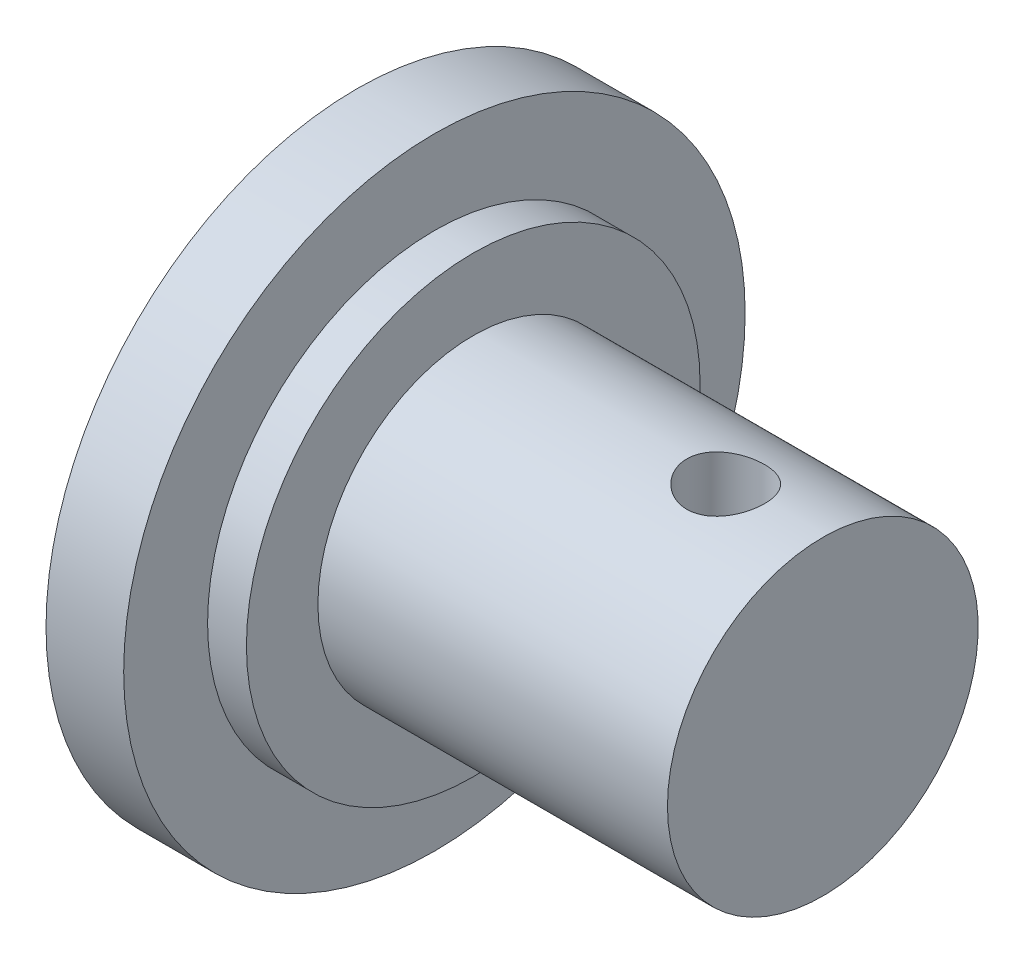
ISO-10303-21;
HEADER;
FILE_DESCRIPTION(('STEP AP214'),'2;1');
FILE_NAME('part.step','',(''),(''),'','','');
FILE_SCHEMA(('AUTOMOTIVE_DESIGN { 1 0 10303 214 1 1 1 1 }'));
ENDSEC;
DATA;
#1=APPLICATION_CONTEXT('core data for automotive mechanical design processes');
#2=APPLICATION_PROTOCOL_DEFINITION('international standard','automotive_design',2000,#1);
#3=PRODUCT_CONTEXT('',#1,'mechanical');
#4=PRODUCT('Part','Part','',(#3));
#5=PRODUCT_RELATED_PRODUCT_CATEGORY('part','',(#4));
#6=PRODUCT_DEFINITION_FORMATION('','',#4);
#7=PRODUCT_DEFINITION_CONTEXT('part definition',#1,'design');
#8=PRODUCT_DEFINITION('design','',#6,#7);
#9=PRODUCT_DEFINITION_SHAPE('','',#8);
#10=(LENGTH_UNIT() NAMED_UNIT(*) SI_UNIT(.MILLI.,.METRE.));
#11=(NAMED_UNIT(*) PLANE_ANGLE_UNIT() SI_UNIT($,.RADIAN.));
#12=(NAMED_UNIT(*) SI_UNIT($,.STERADIAN.) SOLID_ANGLE_UNIT());
#13=UNCERTAINTY_MEASURE_WITH_UNIT(LENGTH_MEASURE(1.E-05),#10,'distance_accuracy_value','');
#14=(GEOMETRIC_REPRESENTATION_CONTEXT(3) GLOBAL_UNCERTAINTY_ASSIGNED_CONTEXT((#13)) GLOBAL_UNIT_ASSIGNED_CONTEXT((#10,
#11,#12)) REPRESENTATION_CONTEXT('',''));
#15=CARTESIAN_POINT('',(0.,0.,0.));
#16=DIRECTION('',(0.,0.,1.));
#17=DIRECTION('',(1.,0.,0.));
#18=AXIS2_PLACEMENT_3D('',#15,#16,#17);
#19=CARTESIAN_POINT('',(135.001,0.,0.));
#20=DIRECTION('',(-1.,0.,0.));
#21=DIRECTION('',(0.,0.,1.));
#22=AXIS2_PLACEMENT_3D('',#19,#20,#21);
#23=PLANE('',#22);
#24=CARTESIAN_POINT('',(135.001,0.,-836.728797606213));
#25=DIRECTION('',(-1.,0.,0.));
#26=DIRECTION('',(0.,0.,1.));
#27=AXIS2_PLACEMENT_3D('',#24,#25,#26);
#28=CIRCLE('',#27,2.413);
#29=CARTESIAN_POINT('',(135.001,0.,-834.315797606213));
#30=VERTEX_POINT('',#29);
#31=EDGE_CURVE('E131',#30,#30,#28,.T.);
#32=ORIENTED_EDGE('',*,*,#31,.F.);
#33=EDGE_LOOP('',(#32));
#34=FACE_BOUND('',#33,.T.);
#35=CARTESIAN_POINT('',(135.001,0.,-836.728797606213));
#36=DIRECTION('',(-1.,0.,0.));
#37=DIRECTION('',(0.,0.,1.));
#38=AXIS2_PLACEMENT_3D('',#35,#36,#37);
#39=CIRCLE('',#38,12.7);
#40=CARTESIAN_POINT('',(135.001,0.,-824.028797606212));
#41=VERTEX_POINT('',#40);
#42=EDGE_CURVE('E60',#41,#41,#39,.T.);
#43=ORIENTED_EDGE('',*,*,#42,.T.);
#44=EDGE_LOOP('',(#43));
#45=FACE_BOUND('',#44,.T.);
#46=ADVANCED_FACE('F35',(#34,#45),#23,.T.);
#47=CARTESIAN_POINT('',(154.051,0.,0.));
#48=DIRECTION('',(-1.,0.,0.));
#49=DIRECTION('',(0.,0.,1.));
#50=AXIS2_PLACEMENT_3D('',#47,#48,#49);
#51=PLANE('',#50);
#52=CARTESIAN_POINT('',(154.051,0.,-836.728797606213));
#53=DIRECTION('',(-1.,0.,0.));
#54=DIRECTION('',(0.,0.,1.));
#55=AXIS2_PLACEMENT_3D('',#52,#53,#54);
#56=CIRCLE('',#55,6.34999999999997);
#57=CARTESIAN_POINT('',(154.051,0.,-830.378797606213));
#58=VERTEX_POINT('',#57);
#59=EDGE_CURVE('E11',#58,#58,#56,.T.);
#60=ORIENTED_EDGE('',*,*,#59,.F.);
#61=EDGE_LOOP('',(#60));
#62=FACE_BOUND('',#61,.T.);
#63=ADVANCED_FACE('F119',(#62),#51,.F.);
#64=CARTESIAN_POINT('',(135.001,0.,-836.728797606213));
#65=DIRECTION('',(-1.,0.,0.));
#66=DIRECTION('',(0.,0.,1.));
#67=AXIS2_PLACEMENT_3D('',#64,#65,#66);
#68=CYLINDRICAL_SURFACE('',#67,6.34999999999997);
#69=CARTESIAN_POINT('',(150.08225,-6.14836106210428,-835.141297606213));
#70=CARTESIAN_POINT('',(150.169912226837,-6.14836273554171,-835.141300096307));
#71=CARTESIAN_POINT('',(150.257602010661,-6.15025634318836,-835.148583440322));
#72=CARTESIAN_POINT('',(150.430463412141,-6.15760682365713,-835.177477921543));
#73=CARTESIAN_POINT('',(150.515633534087,-6.16306577024852,-835.199097397432));
#74=CARTESIAN_POINT('',(150.680930246749,-6.17689090118439,-835.255920694446));
#75=CARTESIAN_POINT('',(150.76106319367,-6.18525333108409,-835.291106979025));
#76=CARTESIAN_POINT('',(150.914297391363,-6.20393851938293,-835.374011681512));
#77=CARTESIAN_POINT('',(150.987398343421,-6.21426136100348,-835.421730631477));
#78=CARTESIAN_POINT('',(151.126102144741,-6.23595854885812,-835.52946775487));
#79=CARTESIAN_POINT('',(151.191527436222,-6.24734969490623,-835.589711182521));
#80=CARTESIAN_POINT('',(151.311458485419,-6.26975425952212,-835.720301995509));
#81=CARTESIAN_POINT('',(151.36596322227,-6.28076764269655,-835.790650324408));
#82=CARTESIAN_POINT('',(151.463232421946,-6.30136163855567,-835.940670403528));
#83=CARTESIAN_POINT('',(151.505822456482,-6.31092011499373,-836.020458550329));
#84=CARTESIAN_POINT('',(151.576919124037,-6.32733565572997,-836.186340484187));
#85=CARTESIAN_POINT('',(151.605427834966,-6.33419311857306,-836.272433338735));
#86=CARTESIAN_POINT('',(151.646983874957,-6.34431521868591,-836.446629794404));
#87=CARTESIAN_POINT('',(151.660332724147,-6.34764982591136,-836.534657329299));
#88=CARTESIAN_POINT('',(151.67213657084,-6.35059432258131,-836.711761305981));
#89=CARTESIAN_POINT('',(151.670593770353,-6.35020476271403,-836.800837590744));
#90=CARTESIAN_POINT('',(151.652874970091,-6.34579690295491,-836.975419298599));
#91=CARTESIAN_POINT('',(151.637024433591,-6.34185931486452,-837.060960098479));
#92=CARTESIAN_POINT('',(151.591663243519,-6.33089181193279,-837.228127073982));
#93=CARTESIAN_POINT('',(151.562151862785,-6.32386173248007,-837.309753040963));
#94=CARTESIAN_POINT('',(151.490043367614,-6.30737568660067,-837.467630748022));
#95=CARTESIAN_POINT('',(151.44733042664,-6.29789837506357,-837.543827265467));
#96=CARTESIAN_POINT('',(151.350119143761,-6.27754588919125,-837.688085156678));
#97=CARTESIAN_POINT('',(151.295618751464,-6.2666704717933,-837.756145111911));
#98=CARTESIAN_POINT('',(151.174634948841,-6.24435958243645,-837.88413888691));
#99=CARTESIAN_POINT('',(151.107867143359,-6.23291691898958,-837.943802921744));
#100=CARTESIAN_POINT('',(150.965154016802,-6.21103052633109,-838.051147603054));
#101=CARTESIAN_POINT('',(150.889208267023,-6.20058684382292,-838.098827689435));
#102=CARTESIAN_POINT('',(150.729765828315,-6.18185515488097,-838.181023761036));
#103=CARTESIAN_POINT('',(150.646234311251,-6.17357784665833,-838.215474793778));
#104=CARTESIAN_POINT('',(150.474308227771,-6.16025336488873,-838.269761028973));
#105=CARTESIAN_POINT('',(150.385914706371,-6.15520550014489,-838.289599359115));
#106=CARTESIAN_POINT('',(150.209275716533,-6.14905651084855,-838.313649426765));
#107=CARTESIAN_POINT('',(150.121088001236,-6.14785466574467,-838.318260057151));
#108=CARTESIAN_POINT('',(149.945203070273,-6.14925963110461,-838.31281589519));
#109=CARTESIAN_POINT('',(149.857505810201,-6.15186609096804,-838.302762452846));
#110=CARTESIAN_POINT('',(149.686572441754,-6.16049747041146,-838.268625275813));
#111=CARTESIAN_POINT('',(149.603286818628,-6.16646576098829,-838.244773789571));
#112=CARTESIAN_POINT('',(149.441896024264,-6.18109456102061,-838.183975088073));
#113=CARTESIAN_POINT('',(149.363791468,-6.1897553893787,-838.14702632151));
#114=CARTESIAN_POINT('',(149.213289788554,-6.20900547054221,-838.060246980352));
#115=CARTESIAN_POINT('',(149.141034686573,-6.21962922065217,-838.010177919898));
#116=CARTESIAN_POINT('',(149.005805389621,-6.24152347750539,-837.898880821246));
#117=CARTESIAN_POINT('',(148.942832722927,-6.25279409032578,-837.837650949216));
#118=CARTESIAN_POINT('',(148.826339987968,-6.27505350925069,-837.703939675776));
#119=CARTESIAN_POINT('',(148.773095860282,-6.28602820809265,-837.631215080856));
#120=CARTESIAN_POINT('',(148.679575724486,-6.3061673254972,-837.47762561499));
#121=CARTESIAN_POINT('',(148.639299039954,-6.31533183847513,-837.396761168933));
#122=CARTESIAN_POINT('',(148.573206768075,-6.33076023493826,-837.22974625146));
#123=CARTESIAN_POINT('',(148.54728717942,-6.33704492064227,-837.143638948594));
#124=CARTESIAN_POINT('',(148.510332687524,-6.34609661306322,-836.968112850719));
#125=CARTESIAN_POINT('',(148.499294911701,-6.34886429864811,-836.878694698216));
#126=CARTESIAN_POINT('',(148.492578951549,-6.35054243936485,-836.701677507984));
#127=CARTESIAN_POINT('',(148.496493536811,-6.3495551647201,-836.614094655904));
#128=CARTESIAN_POINT('',(148.51863842583,-6.34406110626157,-836.440876705654));
#129=CARTESIAN_POINT('',(148.536868303834,-6.33955442711885,-836.355241549635));
#130=CARTESIAN_POINT('',(148.586907898887,-6.32754374655662,-836.188776087126));
#131=CARTESIAN_POINT('',(148.618643982137,-6.32005601147979,-836.107922396065));
#132=CARTESIAN_POINT('',(148.694728294193,-6.30287171149995,-835.952641784509));
#133=CARTESIAN_POINT('',(148.739078112863,-6.29317486818654,-835.878215675704));
#134=CARTESIAN_POINT('',(148.840372933971,-6.27232758869115,-835.73597204484));
#135=CARTESIAN_POINT('',(148.897594226866,-6.26114789401157,-835.668355562286));
#136=CARTESIAN_POINT('',(149.022471277509,-6.23872655372021,-835.543546261532));
#137=CARTESIAN_POINT('',(149.090129676806,-6.22748489312181,-835.486356090167));
#138=CARTESIAN_POINT('',(149.235479745045,-6.20597367928619,-835.382975389177));
#139=CARTESIAN_POINT('',(149.313335045918,-6.19572617421191,-835.337009972841));
#140=CARTESIAN_POINT('',(149.475913090252,-6.17766029436602,-835.258888657835));
#141=CARTESIAN_POINT('',(149.560630783695,-6.16984015341641,-835.226722711969));
#142=CARTESIAN_POINT('',(149.718041006275,-6.15873655124406,-835.181901842115));
#143=CARTESIAN_POINT('',(149.78998039846,-6.15487502513368,-835.166708447893));
#144=CARTESIAN_POINT('',(149.935356829538,-6.14968668754596,-835.146405716753));
#145=CARTESIAN_POINT('',(150.008793740139,-6.14835965985317,-835.141295519647));
#146=CARTESIAN_POINT('',(150.08225,-6.14836106210428,-835.141297606213));
#147=B_SPLINE_CURVE_WITH_KNOTS('',3,(#69,#70,#71,#72,#73,#74,#75,#76,#77,#78,#79,#80,#81,#82,
#83,#84,#85,#86,#87,#88,#89,#90,#91,#92,#93,#94,#95,#96,#97,#98,#99,#100,#101,#102,#103,#104,
#105,#106,#107,#108,#109,#110,#111,#112,#113,#114,#115,#116,#117,#118,#119,#120,#121,#122,#123,
#124,#125,#126,#127,#128,#129,#130,#131,#132,#133,#134,#135,#136,#137,#138,#139,#140,#141,#142,
#143,#144,#145,#146),.UNSPECIFIED.,.T.,.F.,(4,2,2,2,2,2,2,2,2,2,2,2,2,2,2,2,2,2,2,2,2,2,2,2,2,2,
2,2,2,2,2,2,2,2,2,2,2,2,4),(0.,0.26271692550243,0.525586795807142,0.788118011750303,
1.05066037489717,1.31841210912525,1.5861888613969,1.85770200212658,2.12917506502872,
2.39514856882023,2.66108274402888,2.92111596807445,3.18116303520203,3.44355975151537,
3.70600214772711,3.97554746273111,4.24510537311818,4.51597034325286,4.78677732082211,
5.05043169973633,5.31406180761653,5.57337852180791,5.83272596102542,6.09716107120498,
6.36163966991943,6.63273585162917,6.90381788981847,7.17290966232322,7.44194948557145,
7.70371488290856,7.96547249534305,8.22582096615332,8.48620226643581,8.75282156329508,
9.01950845044003,9.29117063075672,9.56263468067701,9.78279620257503,10.0029389418809),.UNSPECIFIED.);
#148=CARTESIAN_POINT('',(150.08225,-6.14836106210428,-835.141297606213));
#149=VERTEX_POINT('',#148);
#150=EDGE_CURVE('E38',#149,#149,#147,.T.);
#151=ORIENTED_EDGE('',*,*,#150,.T.);
#152=EDGE_LOOP('',(#151));
#153=FACE_BOUND('',#152,.T.);
#154=CARTESIAN_POINT('',(150.08225,6.14836106210428,-835.141297606213));
#155=CARTESIAN_POINT('',(149.994587773163,6.14836273554171,-835.141300096307));
#156=CARTESIAN_POINT('',(149.90689798934,6.15025634318836,-835.148583440322));
#157=CARTESIAN_POINT('',(149.73403658786,6.15760682365713,-835.177477921543));
#158=CARTESIAN_POINT('',(149.648866465913,6.16306577024852,-835.199097397432));
#159=CARTESIAN_POINT('',(149.483569753251,6.17689090118439,-835.255920694446));
#160=CARTESIAN_POINT('',(149.40343680633,6.18525333108409,-835.291106979025));
#161=CARTESIAN_POINT('',(149.250202608637,6.20393851938293,-835.374011681512));
#162=CARTESIAN_POINT('',(149.177101656579,6.21426136100348,-835.421730631477));
#163=CARTESIAN_POINT('',(149.038397855259,6.23595854885812,-835.52946775487));
#164=CARTESIAN_POINT('',(148.972972563778,6.24734969490623,-835.589711182521));
#165=CARTESIAN_POINT('',(148.853041514581,6.26975425952212,-835.720301995509));
#166=CARTESIAN_POINT('',(148.79853677773,6.28076764269655,-835.790650324408));
#167=CARTESIAN_POINT('',(148.701267578054,6.30136163855567,-835.940670403528));
#168=CARTESIAN_POINT('',(148.658677543518,6.31092011499373,-836.020458550329));
#169=CARTESIAN_POINT('',(148.587580875963,6.32733565572997,-836.186340484187));
#170=CARTESIAN_POINT('',(148.559072165034,6.33419311857306,-836.272433338735));
#171=CARTESIAN_POINT('',(148.517516125043,6.34431521868591,-836.446629794404));
#172=CARTESIAN_POINT('',(148.504167275853,6.34764982591136,-836.534657329299));
#173=CARTESIAN_POINT('',(148.49236342916,6.35059432258131,-836.711761305981));
#174=CARTESIAN_POINT('',(148.493906229647,6.35020476271404,-836.800837590744));
#175=CARTESIAN_POINT('',(148.511625029909,6.34579690295491,-836.975419298599));
#176=CARTESIAN_POINT('',(148.527475566409,6.34185931486452,-837.060960098479));
#177=CARTESIAN_POINT('',(148.572836756481,6.33089181193279,-837.228127073982));
#178=CARTESIAN_POINT('',(148.602348137215,6.32386173248007,-837.309753040963));
#179=CARTESIAN_POINT('',(148.674456632386,6.30737568660067,-837.467630748022));
#180=CARTESIAN_POINT('',(148.71716957336,6.29789837506357,-837.543827265467));
#181=CARTESIAN_POINT('',(148.814380856239,6.27754588919125,-837.688085156678));
#182=CARTESIAN_POINT('',(148.868881248536,6.2666704717933,-837.756145111911));
#183=CARTESIAN_POINT('',(148.989865051159,6.24435958243645,-837.88413888691));
#184=CARTESIAN_POINT('',(149.056632856641,6.23291691898958,-837.943802921744));
#185=CARTESIAN_POINT('',(149.199345983198,6.21103052633109,-838.051147603054));
#186=CARTESIAN_POINT('',(149.275291732977,6.20058684382292,-838.098827689435));
#187=CARTESIAN_POINT('',(149.434734171685,6.18185515488097,-838.181023761036));
#188=CARTESIAN_POINT('',(149.518265688749,6.17357784665833,-838.215474793778));
#189=CARTESIAN_POINT('',(149.690191772229,6.16025336488873,-838.269761028973));
#190=CARTESIAN_POINT('',(149.778585293629,6.15520550014489,-838.289599359115));
#191=CARTESIAN_POINT('',(149.955224283467,6.14905651084855,-838.313649426765));
#192=CARTESIAN_POINT('',(150.043411998764,6.14785466574467,-838.318260057151));
#193=CARTESIAN_POINT('',(150.219296929727,6.14925963110461,-838.31281589519));
#194=CARTESIAN_POINT('',(150.306994189799,6.15186609096804,-838.302762452846));
#195=CARTESIAN_POINT('',(150.477927558246,6.16049747041146,-838.268625275813));
#196=CARTESIAN_POINT('',(150.561213181372,6.16646576098829,-838.244773789571));
#197=CARTESIAN_POINT('',(150.722603975736,6.18109456102061,-838.183975088073));
#198=CARTESIAN_POINT('',(150.800708532,6.18975538937869,-838.14702632151));
#199=CARTESIAN_POINT('',(150.951210211446,6.20900547054222,-838.060246980352));
#200=CARTESIAN_POINT('',(151.023465313427,6.21962922065218,-838.010177919898));
#201=CARTESIAN_POINT('',(151.158694610379,6.24152347750539,-837.898880821246));
#202=CARTESIAN_POINT('',(151.221667277073,6.25279409032578,-837.837650949216));
#203=CARTESIAN_POINT('',(151.338160012033,6.27505350925069,-837.703939675776));
#204=CARTESIAN_POINT('',(151.391404139719,6.28602820809265,-837.631215080856));
#205=CARTESIAN_POINT('',(151.484924275514,6.3061673254972,-837.47762561499));
#206=CARTESIAN_POINT('',(151.525200960046,6.31533183847513,-837.396761168933));
#207=CARTESIAN_POINT('',(151.591293231925,6.33076023493826,-837.22974625146));
#208=CARTESIAN_POINT('',(151.617212820581,6.33704492064227,-837.143638948594));
#209=CARTESIAN_POINT('',(151.654167312476,6.34609661306322,-836.968112850719));
#210=CARTESIAN_POINT('',(151.665205088299,6.34886429864811,-836.878694698216));
#211=CARTESIAN_POINT('',(151.671921048451,6.35054243936485,-836.701677507984));
#212=CARTESIAN_POINT('',(151.668006463189,6.3495551647201,-836.614094655904));
#213=CARTESIAN_POINT('',(151.64586157417,6.34406110626157,-836.440876705654));
#214=CARTESIAN_POINT('',(151.627631696167,6.33955442711885,-836.355241549635));
#215=CARTESIAN_POINT('',(151.577592101114,6.32754374655662,-836.188776087126));
#216=CARTESIAN_POINT('',(151.545856017863,6.32005601147979,-836.107922396065));
#217=CARTESIAN_POINT('',(151.469771705807,6.30287171149994,-835.952641784509));
#218=CARTESIAN_POINT('',(151.425421887137,6.29317486818654,-835.878215675704));
#219=CARTESIAN_POINT('',(151.32412706603,6.27232758869115,-835.73597204484));
#220=CARTESIAN_POINT('',(151.266905773135,6.26114789401157,-835.668355562286));
#221=CARTESIAN_POINT('',(151.142028722492,6.23872655372021,-835.543546261532));
#222=CARTESIAN_POINT('',(151.074370323195,6.22748489312181,-835.486356090167));
#223=CARTESIAN_POINT('',(150.929020254955,6.20597367928619,-835.382975389177));
#224=CARTESIAN_POINT('',(150.851164954082,6.19572617421191,-835.337009972841));
#225=CARTESIAN_POINT('',(150.688586909748,6.17766029436602,-835.258888657835));
#226=CARTESIAN_POINT('',(150.603869216306,6.16984015341641,-835.226722711969));
#227=CARTESIAN_POINT('',(150.446458993725,6.15873655124406,-835.181901842115));
#228=CARTESIAN_POINT('',(150.374519601541,6.15487502513368,-835.166708447893));
#229=CARTESIAN_POINT('',(150.229143170463,6.14968668754596,-835.146405716753));
#230=CARTESIAN_POINT('',(150.155706259861,6.14835965985317,-835.141295519647));
#231=CARTESIAN_POINT('',(150.08225,6.14836106210428,-835.141297606213));
#232=B_SPLINE_CURVE_WITH_KNOTS('',3,(#154,#155,#156,#157,#158,#159,#160,#161,#162,#163,#164,
#165,#166,#167,#168,#169,#170,#171,#172,#173,#174,#175,#176,#177,#178,#179,#180,#181,#182,#183,
#184,#185,#186,#187,#188,#189,#190,#191,#192,#193,#194,#195,#196,#197,#198,#199,#200,#201,#202,
#203,#204,#205,#206,#207,#208,#209,#210,#211,#212,#213,#214,#215,#216,#217,#218,#219,#220,#221,
#222,#223,#224,#225,#226,#227,#228,#229,#230,#231),.UNSPECIFIED.,.T.,.F.,(4,2,2,2,2,2,2,2,2,2,2,
2,2,2,2,2,2,2,2,2,2,2,2,2,2,2,2,2,2,2,2,2,2,2,2,2,2,2,4),(0.,0.26271692550243,0.525586795807142,
0.788118011750303,1.05066037489717,1.31841210912525,1.5861888613969,1.85770200212658,
2.12917506502872,2.39514856882012,2.66108274402888,2.92111596807445,3.18116303520203,
3.44355975151537,3.70600214772711,3.97554746273111,4.24510537311818,4.51597034325286,
4.78677732082211,5.05043169973631,5.31406180761653,5.57337852180791,5.83272596102542,
6.097161071205,6.36163966991944,6.63273585162918,6.90381788981847,7.17290966232322,
7.44194948557145,7.70371488290856,7.96547249534306,8.22582096615333,8.48620226643581,
8.75282156329508,9.01950845044003,9.29117063075671,9.56263468067701,9.78279620257503,
10.0029389418809),.UNSPECIFIED.);
#233=CARTESIAN_POINT('',(150.08225,6.14836106210428,-835.141297606213));
#234=VERTEX_POINT('',#233);
#235=EDGE_CURVE('E80',#234,#234,#232,.T.);
#236=ORIENTED_EDGE('',*,*,#235,.T.);
#237=EDGE_LOOP('',(#236));
#238=FACE_BOUND('',#237,.T.);
#239=CARTESIAN_POINT('',(139.7635,0.,-836.728797606213));
#240=DIRECTION('',(-1.,0.,0.));
#241=DIRECTION('',(0.,0.,1.));
#242=AXIS2_PLACEMENT_3D('',#239,#240,#241);
#243=CIRCLE('',#242,6.34999999999997);
#244=CARTESIAN_POINT('',(139.7635,0.,-830.378797606213));
#245=VERTEX_POINT('',#244);
#246=EDGE_CURVE('E46',#245,#245,#243,.T.);
#247=ORIENTED_EDGE('',*,*,#246,.F.);
#248=EDGE_LOOP('',(#247));
#249=FACE_BOUND('',#248,.T.);
#250=ORIENTED_EDGE('',*,*,#59,.T.);
#251=EDGE_LOOP('',(#250));
#252=FACE_BOUND('',#251,.T.);
#253=ADVANCED_FACE('F84',(#153,#238,#249,#252),#68,.T.);
#254=CARTESIAN_POINT('',(139.7635,0.,0.));
#255=DIRECTION('',(1.,0.,0.));
#256=DIRECTION('',(0.,0.,-1.));
#257=AXIS2_PLACEMENT_3D('',#254,#255,#256);
#258=PLANE('',#257);
#259=ORIENTED_EDGE('',*,*,#246,.T.);
#260=EDGE_LOOP('',(#259));
#261=FACE_BOUND('',#260,.T.);
#262=CARTESIAN_POINT('',(139.7635,0.,-836.728797606213));
#263=DIRECTION('',(-1.,0.,0.));
#264=DIRECTION('',(0.,0.,1.));
#265=AXIS2_PLACEMENT_3D('',#262,#263,#264);
#266=CIRCLE('',#265,9.27100000000003);
#267=CARTESIAN_POINT('',(139.7635,0.,-827.457797606212));
#268=VERTEX_POINT('',#267);
#269=EDGE_CURVE('E76',#268,#268,#266,.T.);
#270=ORIENTED_EDGE('',*,*,#269,.F.);
#271=EDGE_LOOP('',(#270));
#272=FACE_BOUND('',#271,.T.);
#273=ADVANCED_FACE('F112',(#261,#272),#258,.T.);
#274=CARTESIAN_POINT('',(135.001,0.,-836.728797606213));
#275=DIRECTION('',(-1.,0.,0.));
#276=DIRECTION('',(0.,0.,1.));
#277=AXIS2_PLACEMENT_3D('',#274,#275,#276);
#278=CYLINDRICAL_SURFACE('',#277,9.27100000000003);
#279=ORIENTED_EDGE('',*,*,#269,.T.);
#280=EDGE_LOOP('',(#279));
#281=FACE_BOUND('',#280,.T.);
#282=CARTESIAN_POINT('',(138.176,0.,-836.728797606213));
#283=DIRECTION('',(-1.,0.,0.));
#284=DIRECTION('',(0.,0.,1.));
#285=AXIS2_PLACEMENT_3D('',#282,#283,#284);
#286=CIRCLE('',#285,9.27100000000003);
#287=CARTESIAN_POINT('',(138.176,0.,-827.457797606212));
#288=VERTEX_POINT('',#287);
#289=EDGE_CURVE('E73',#288,#288,#286,.T.);
#290=ORIENTED_EDGE('',*,*,#289,.F.);
#291=EDGE_LOOP('',(#290));
#292=FACE_BOUND('',#291,.T.);
#293=ADVANCED_FACE('F109',(#281,#292),#278,.T.);
#294=CARTESIAN_POINT('',(138.176,0.,0.));
#295=DIRECTION('',(1.,0.,0.));
#296=DIRECTION('',(0.,0.,-1.));
#297=AXIS2_PLACEMENT_3D('',#294,#295,#296);
#298=PLANE('',#297);
#299=ORIENTED_EDGE('',*,*,#289,.T.);
#300=EDGE_LOOP('',(#299));
#301=FACE_BOUND('',#300,.T.);
#302=CARTESIAN_POINT('',(138.176,0.,-836.728797606213));
#303=DIRECTION('',(-1.,0.,0.));
#304=DIRECTION('',(0.,0.,1.));
#305=AXIS2_PLACEMENT_3D('',#302,#303,#304);
#306=CIRCLE('',#305,12.7);
#307=CARTESIAN_POINT('',(138.176,0.,-824.028797606212));
#308=VERTEX_POINT('',#307);
#309=EDGE_CURVE('E64',#308,#308,#306,.T.);
#310=ORIENTED_EDGE('',*,*,#309,.F.);
#311=EDGE_LOOP('',(#310));
#312=FACE_BOUND('',#311,.T.);
#313=ADVANCED_FACE('F105',(#301,#312),#298,.T.);
#314=CARTESIAN_POINT('',(135.001,0.,-836.728797606213));
#315=DIRECTION('',(-1.,0.,0.));
#316=DIRECTION('',(0.,0.,1.));
#317=AXIS2_PLACEMENT_3D('',#314,#315,#316);
#318=CYLINDRICAL_SURFACE('',#317,12.7);
#319=ORIENTED_EDGE('',*,*,#309,.T.);
#320=EDGE_LOOP('',(#319));
#321=FACE_BOUND('',#320,.T.);
#322=ORIENTED_EDGE('',*,*,#42,.F.);
#323=EDGE_LOOP('',(#322));
#324=FACE_BOUND('',#323,.T.);
#325=ADVANCED_FACE('F54',(#321,#324),#318,.T.);
#326=CARTESIAN_POINT('',(146.177,0.,-836.728797606213));
#327=DIRECTION('',(-1.,0.,0.));
#328=DIRECTION('',(0.,0.,1.));
#329=AXIS2_PLACEMENT_3D('',#326,#327,#328);
#330=CONICAL_SURFACE('',#329,2.0193,1.02974425867665);
#331=CARTESIAN_POINT('',(147.390317848002,0.,-836.728797606213));
#332=VERTEX_POINT('',#331);
#333=VERTEX_LOOP('',#332);
#334=FACE_BOUND('',#333,.T.);
#335=CARTESIAN_POINT('',(146.177,0.,-836.728797606213));
#336=DIRECTION('',(-1.,0.,0.));
#337=DIRECTION('',(0.,0.,1.));
#338=AXIS2_PLACEMENT_3D('',#335,#336,#337);
#339=CIRCLE('',#338,2.0193);
#340=CARTESIAN_POINT('',(146.177,0.,-834.709497606213));
#341=VERTEX_POINT('',#340);
#342=EDGE_CURVE('E58',#341,#341,#339,.T.);
#343=ORIENTED_EDGE('',*,*,#342,.T.);
#344=EDGE_LOOP('',(#343));
#345=FACE_BOUND('',#344,.T.);
#346=ADVANCED_FACE('F50',(#334,#345),#330,.F.);
#347=CARTESIAN_POINT('',(135.001,0.,-836.728797606213));
#348=DIRECTION('',(-1.,0.,0.));
#349=DIRECTION('',(0.,0.,1.));
#350=AXIS2_PLACEMENT_3D('',#347,#348,#349);
#351=CYLINDRICAL_SURFACE('',#350,2.0193);
#352=ORIENTED_EDGE('',*,*,#342,.F.);
#353=EDGE_LOOP('',(#352));
#354=FACE_BOUND('',#353,.T.);
#355=CARTESIAN_POINT('',(144.653,0.,-836.728797606213));
#356=DIRECTION('',(-1.,0.,0.));
#357=DIRECTION('',(0.,0.,1.));
#358=AXIS2_PLACEMENT_3D('',#355,#356,#357);
#359=CIRCLE('',#358,2.0193);
#360=CARTESIAN_POINT('',(144.653,0.,-834.709497606213));
#361=VERTEX_POINT('',#360);
#362=EDGE_CURVE('E61',#361,#361,#359,.T.);
#363=ORIENTED_EDGE('',*,*,#362,.T.);
#364=EDGE_LOOP('',(#363));
#365=FACE_BOUND('',#364,.T.);
#366=ADVANCED_FACE('F53',(#354,#365),#351,.F.);
#367=CARTESIAN_POINT('',(144.653,2.0193,-836.728797606213));
#368=DIRECTION('',(1.,0.,0.));
#369=DIRECTION('',(0.,0.,-1.));
#370=AXIS2_PLACEMENT_3D('',#367,#368,#369);
#371=PLANE('',#370);
#372=ORIENTED_EDGE('',*,*,#362,.F.);
#373=EDGE_LOOP('',(#372));
#374=FACE_BOUND('',#373,.T.);
#375=CARTESIAN_POINT('',(144.653,0.,-836.728797606213));
#376=DIRECTION('',(-1.,0.,0.));
#377=DIRECTION('',(0.,0.,1.));
#378=AXIS2_PLACEMENT_3D('',#375,#376,#377);
#379=CIRCLE('',#378,2.413);
#380=CARTESIAN_POINT('',(144.653,0.,-834.315797606213));
#381=VERTEX_POINT('',#380);
#382=EDGE_CURVE('E67',#381,#381,#379,.T.);
#383=ORIENTED_EDGE('',*,*,#382,.T.);
#384=EDGE_LOOP('',(#383));
#385=FACE_BOUND('',#384,.T.);
#386=ADVANCED_FACE('F96',(#374,#385),#371,.F.);
#387=CARTESIAN_POINT('',(135.001,0.,-836.728797606213));
#388=DIRECTION('',(-1.,0.,0.));
#389=DIRECTION('',(0.,0.,1.));
#390=AXIS2_PLACEMENT_3D('',#387,#388,#389);
#391=CYLINDRICAL_SURFACE('',#390,2.413);
#392=ORIENTED_EDGE('',*,*,#382,.F.);
#393=EDGE_LOOP('',(#392));
#394=FACE_BOUND('',#393,.T.);
#395=ORIENTED_EDGE('',*,*,#31,.T.);
#396=EDGE_LOOP('',(#395));
#397=FACE_BOUND('',#396,.T.);
#398=ADVANCED_FACE('F91',(#394,#397),#391,.F.);
#399=CARTESIAN_POINT('',(150.08225,-12.7,-836.728797606213));
#400=DIRECTION('',(0.,1.,0.));
#401=DIRECTION('',(0.,0.,1.));
#402=AXIS2_PLACEMENT_3D('',#399,#400,#401);
#403=CYLINDRICAL_SURFACE('',#402,1.58749999999984);
#404=ORIENTED_EDGE('',*,*,#235,.F.);
#405=EDGE_LOOP('',(#404));
#406=FACE_BOUND('',#405,.T.);
#407=ORIENTED_EDGE('',*,*,#150,.F.);
#408=EDGE_LOOP('',(#407));
#409=FACE_BOUND('',#408,.T.);
#410=ADVANCED_FACE('F87',(#406,#409),#403,.F.);
#411=CLOSED_SHELL('',(#46,#63,#253,#273,#293,#313,#325,#346,#366,#386,#398,#410));
#412=MANIFOLD_SOLID_BREP('B2',#411);
#413=ADVANCED_BREP_SHAPE_REPRESENTATION('',(#18,#412),#14);
#414=SHAPE_DEFINITION_REPRESENTATION(#9,#413);
ENDSEC;
END-ISO-10303-21;
